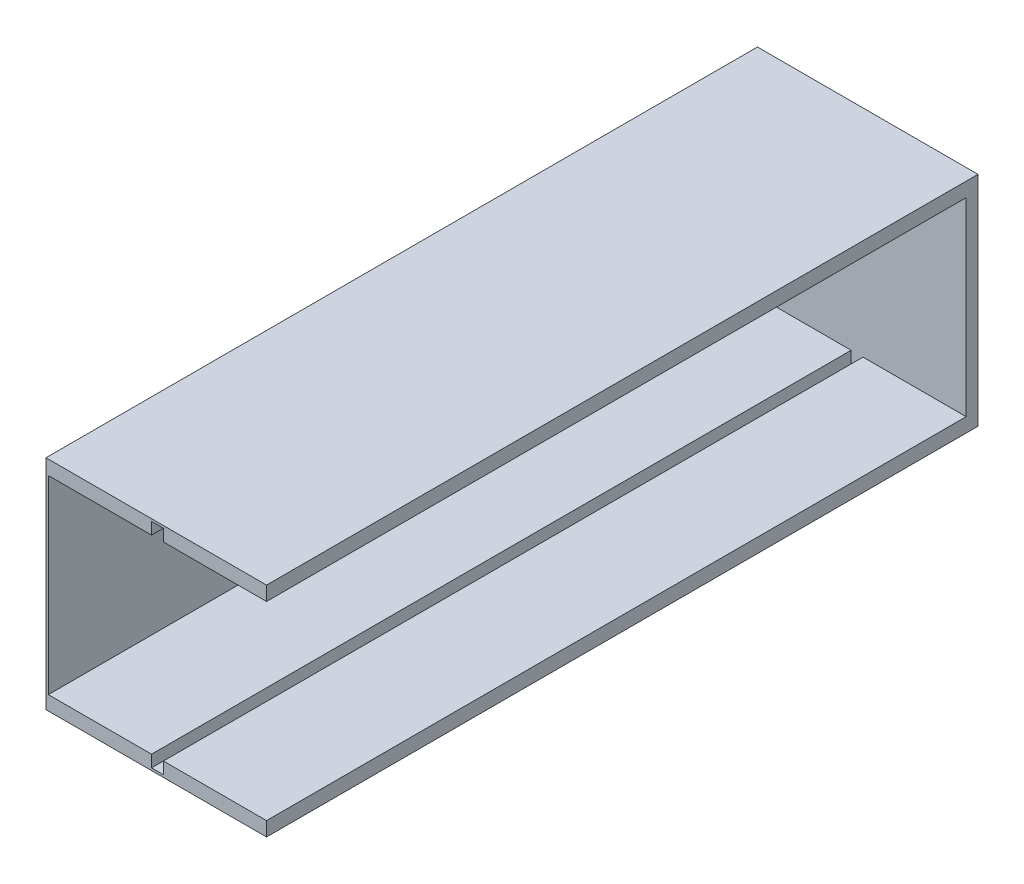
ISO-10303-21;
HEADER;
FILE_DESCRIPTION(('STEP AP214'),'2;1');
FILE_NAME('part.step','',(''),(''),'','','');
FILE_SCHEMA(('AUTOMOTIVE_DESIGN { 1 0 10303 214 1 1 1 1 }'));
ENDSEC;
DATA;
#1=APPLICATION_CONTEXT('core data for automotive mechanical design processes');
#2=APPLICATION_PROTOCOL_DEFINITION('international standard','automotive_design',2000,#1);
#3=PRODUCT_CONTEXT('',#1,'mechanical');
#4=PRODUCT('Part','Part','',(#3));
#5=PRODUCT_RELATED_PRODUCT_CATEGORY('part','',(#4));
#6=PRODUCT_DEFINITION_FORMATION('','',#4);
#7=PRODUCT_DEFINITION_CONTEXT('part definition',#1,'design');
#8=PRODUCT_DEFINITION('design','',#6,#7);
#9=PRODUCT_DEFINITION_SHAPE('','',#8);
#10=(LENGTH_UNIT() NAMED_UNIT(*) SI_UNIT(.MILLI.,.METRE.));
#11=(NAMED_UNIT(*) PLANE_ANGLE_UNIT() SI_UNIT($,.RADIAN.));
#12=(NAMED_UNIT(*) SI_UNIT($,.STERADIAN.) SOLID_ANGLE_UNIT());
#13=UNCERTAINTY_MEASURE_WITH_UNIT(LENGTH_MEASURE(1.E-05),#10,'distance_accuracy_value','');
#14=(GEOMETRIC_REPRESENTATION_CONTEXT(3) GLOBAL_UNCERTAINTY_ASSIGNED_CONTEXT((#13)) GLOBAL_UNIT_ASSIGNED_CONTEXT((#10,
#11,#12)) REPRESENTATION_CONTEXT('',''));
#15=CARTESIAN_POINT('',(0.,0.,0.));
#16=DIRECTION('',(0.,0.,1.));
#17=DIRECTION('',(1.,0.,0.));
#18=AXIS2_PLACEMENT_3D('',#15,#16,#17);
#19=CARTESIAN_POINT('',(0.,0.,25.));
#20=DIRECTION('',(0.,0.,1.));
#21=DIRECTION('',(1.,0.,0.));
#22=AXIS2_PLACEMENT_3D('',#19,#20,#21);
#23=PLANE('',#22);
#24=DIRECTION('',(0.,1.,0.));
#25=VECTOR('',#24,1.);
#26=CARTESIAN_POINT('',(242.5,0.,25.));
#27=LINE('',#26,#25);
#28=CARTESIAN_POINT('',(242.5,-455.,24.9999999999999));
#29=VERTEX_POINT('',#28);
#30=CARTESIAN_POINT('',(242.5,-430.,24.9999999999999));
#31=VERTEX_POINT('',#30);
#32=EDGE_CURVE('E43',#29,#31,#27,.T.);
#33=ORIENTED_EDGE('',*,*,#32,.T.);
#34=DIRECTION('',(1.,0.,0.));
#35=VECTOR('',#34,1.);
#36=CARTESIAN_POINT('',(0.,-430.,25.));
#37=LINE('',#36,#35);
#38=CARTESIAN_POINT('',(460.,-430.,24.9999999999999));
#39=VERTEX_POINT('',#38);
#40=EDGE_CURVE('E11',#31,#39,#37,.T.);
#41=ORIENTED_EDGE('',*,*,#40,.T.);
#42=DIRECTION('',(0.,-1.,0.));
#43=VECTOR('',#42,1.);
#44=CARTESIAN_POINT('',(460.,0.,25.));
#45=LINE('',#44,#43);
#46=CARTESIAN_POINT('',(460.,-30.,24.9999999999999));
#47=VERTEX_POINT('',#46);
#48=EDGE_CURVE('E215',#47,#39,#45,.T.);
#49=ORIENTED_EDGE('',*,*,#48,.F.);
#50=DIRECTION('',(1.,0.,0.));
#51=VECTOR('',#50,1.);
#52=CARTESIAN_POINT('',(242.5,-30.,24.9999999999999));
#53=LINE('',#52,#51);
#54=CARTESIAN_POINT('',(242.5,-30.,24.9999999999999));
#55=VERTEX_POINT('',#54);
#56=EDGE_CURVE('E222',#55,#47,#53,.T.);
#57=ORIENTED_EDGE('',*,*,#56,.F.);
#58=DIRECTION('',(0.,-1.,0.));
#59=VECTOR('',#58,1.);
#60=CARTESIAN_POINT('',(242.5,-5.00000000000004,24.9999999999999));
#61=LINE('',#60,#59);
#62=CARTESIAN_POINT('',(242.5,-5.00000000000004,24.9999999999999));
#63=VERTEX_POINT('',#62);
#64=EDGE_CURVE('E224',#63,#55,#61,.T.);
#65=ORIENTED_EDGE('',*,*,#64,.F.);
#66=DIRECTION('',(1.,0.,0.));
#67=VECTOR('',#66,1.);
#68=CARTESIAN_POINT('',(217.5,-5.00000000000004,24.9999999999999));
#69=LINE('',#68,#67);
#70=CARTESIAN_POINT('',(217.5,-5.00000000000004,24.9999999999999));
#71=VERTEX_POINT('',#70);
#72=EDGE_CURVE('E226',#71,#63,#69,.T.);
#73=ORIENTED_EDGE('',*,*,#72,.F.);
#74=DIRECTION('',(0.,1.,0.));
#75=VECTOR('',#74,1.);
#76=CARTESIAN_POINT('',(217.5,-30.,24.9999999999999));
#77=LINE('',#76,#75);
#78=CARTESIAN_POINT('',(217.5,-30.,24.9999999999999));
#79=VERTEX_POINT('',#78);
#80=EDGE_CURVE('E228',#79,#71,#77,.T.);
#81=ORIENTED_EDGE('',*,*,#80,.F.);
#82=DIRECTION('',(1.,0.,0.));
#83=VECTOR('',#82,1.);
#84=CARTESIAN_POINT('',(0.,-30.,24.9999999999999));
#85=LINE('',#84,#83);
#86=CARTESIAN_POINT('',(0.,-30.,24.9999999999999));
#87=VERTEX_POINT('',#86);
#88=EDGE_CURVE('E230',#87,#79,#85,.T.);
#89=ORIENTED_EDGE('',*,*,#88,.F.);
#90=DIRECTION('',(0.,1.,0.));
#91=VECTOR('',#90,1.);
#92=CARTESIAN_POINT('',(0.,0.,25.));
#93=LINE('',#92,#91);
#94=CARTESIAN_POINT('',(0.,-430.,24.9999999999999));
#95=VERTEX_POINT('',#94);
#96=EDGE_CURVE('E58',#95,#87,#93,.T.);
#97=ORIENTED_EDGE('',*,*,#96,.F.);
#98=DIRECTION('',(1.,0.,0.));
#99=VECTOR('',#98,1.);
#100=CARTESIAN_POINT('',(2.19492368086813E-13,-430.,25.));
#101=LINE('',#100,#99);
#102=CARTESIAN_POINT('',(217.5,-430.,25.));
#103=VERTEX_POINT('',#102);
#104=EDGE_CURVE('E264',#95,#103,#101,.T.);
#105=ORIENTED_EDGE('',*,*,#104,.T.);
#106=DIRECTION('',(0.,-1.,0.));
#107=VECTOR('',#106,1.);
#108=CARTESIAN_POINT('',(217.5,0.,25.));
#109=LINE('',#108,#107);
#110=CARTESIAN_POINT('',(217.5,-455.,24.9999999999999));
#111=VERTEX_POINT('',#110);
#112=EDGE_CURVE('E267',#103,#111,#109,.T.);
#113=ORIENTED_EDGE('',*,*,#112,.T.);
#114=DIRECTION('',(1.,0.,0.));
#115=VECTOR('',#114,1.);
#116=CARTESIAN_POINT('',(0.,-455.,25.));
#117=LINE('',#116,#115);
#118=EDGE_CURVE('E270',#111,#29,#117,.T.);
#119=ORIENTED_EDGE('',*,*,#118,.T.);
#120=EDGE_LOOP('',(#33,#41,#49,#57,#65,#73,#81,#89,#97,#105,#113,#119));
#121=FACE_BOUND('',#120,.T.);
#122=ADVANCED_FACE('F35',(#121),#23,.T.);
#123=CARTESIAN_POINT('',(0.,-30.,1500.));
#124=DIRECTION('',(0.,1.,0.));
#125=DIRECTION('',(-1.,0.,0.));
#126=AXIS2_PLACEMENT_3D('',#123,#124,#125);
#127=PLANE('',#126);
#128=DIRECTION('',(0.,0.,-1.));
#129=VECTOR('',#128,1.);
#130=CARTESIAN_POINT('',(0.,-30.,1500.));
#131=LINE('',#130,#129);
#132=CARTESIAN_POINT('',(0.,-30.,1500.));
#133=VERTEX_POINT('',#132);
#134=EDGE_CURVE('E262',#133,#87,#131,.T.);
#135=ORIENTED_EDGE('',*,*,#134,.T.);
#136=ORIENTED_EDGE('',*,*,#88,.T.);
#137=DIRECTION('',(0.,0.,-1.));
#138=VECTOR('',#137,1.);
#139=CARTESIAN_POINT('',(217.5,-30.,1500.));
#140=LINE('',#139,#138);
#141=CARTESIAN_POINT('',(217.5,-30.,1500.));
#142=VERTEX_POINT('',#141);
#143=EDGE_CURVE('E259',#142,#79,#140,.T.);
#144=ORIENTED_EDGE('',*,*,#143,.F.);
#145=DIRECTION('',(1.,0.,0.));
#146=VECTOR('',#145,1.);
#147=CARTESIAN_POINT('',(0.,-30.,1500.));
#148=LINE('',#147,#146);
#149=EDGE_CURVE('E233',#133,#142,#148,.T.);
#150=ORIENTED_EDGE('',*,*,#149,.F.);
#151=EDGE_LOOP('',(#135,#136,#144,#150));
#152=FACE_BOUND('',#151,.T.);
#153=ADVANCED_FACE('F37',(#152),#127,.F.);
#154=CARTESIAN_POINT('',(217.5,-30.,1500.));
#155=DIRECTION('',(-1.,0.,0.));
#156=DIRECTION('',(0.,0.,1.));
#157=AXIS2_PLACEMENT_3D('',#154,#155,#156);
#158=PLANE('',#157);
#159=ORIENTED_EDGE('',*,*,#143,.T.);
#160=ORIENTED_EDGE('',*,*,#80,.T.);
#161=DIRECTION('',(0.,0.,-1.));
#162=VECTOR('',#161,1.);
#163=CARTESIAN_POINT('',(217.5,-5.00000000000004,1500.));
#164=LINE('',#163,#162);
#165=CARTESIAN_POINT('',(217.5,-5.00000000000004,1500.));
#166=VERTEX_POINT('',#165);
#167=EDGE_CURVE('E256',#166,#71,#164,.T.);
#168=ORIENTED_EDGE('',*,*,#167,.F.);
#169=DIRECTION('',(0.,1.,0.));
#170=VECTOR('',#169,1.);
#171=CARTESIAN_POINT('',(217.5,-30.,1500.));
#172=LINE('',#171,#170);
#173=EDGE_CURVE('E235',#142,#166,#172,.T.);
#174=ORIENTED_EDGE('',*,*,#173,.F.);
#175=EDGE_LOOP('',(#159,#160,#168,#174));
#176=FACE_BOUND('',#175,.T.);
#177=ADVANCED_FACE('F311',(#176),#158,.F.);
#178=CARTESIAN_POINT('',(217.5,-5.00000000000004,1500.));
#179=DIRECTION('',(0.,1.,0.));
#180=DIRECTION('',(-1.,0.,0.));
#181=AXIS2_PLACEMENT_3D('',#178,#179,#180);
#182=PLANE('',#181);
#183=ORIENTED_EDGE('',*,*,#167,.T.);
#184=ORIENTED_EDGE('',*,*,#72,.T.);
#185=DIRECTION('',(0.,0.,-1.));
#186=VECTOR('',#185,1.);
#187=CARTESIAN_POINT('',(242.5,-5.00000000000004,1500.));
#188=LINE('',#187,#186);
#189=CARTESIAN_POINT('',(242.5,-5.00000000000004,1500.));
#190=VERTEX_POINT('',#189);
#191=EDGE_CURVE('E253',#190,#63,#188,.T.);
#192=ORIENTED_EDGE('',*,*,#191,.F.);
#193=DIRECTION('',(1.,0.,0.));
#194=VECTOR('',#193,1.);
#195=CARTESIAN_POINT('',(217.5,-5.00000000000004,1500.));
#196=LINE('',#195,#194);
#197=EDGE_CURVE('E237',#166,#190,#196,.T.);
#198=ORIENTED_EDGE('',*,*,#197,.F.);
#199=EDGE_LOOP('',(#183,#184,#192,#198));
#200=FACE_BOUND('',#199,.T.);
#201=ADVANCED_FACE('F306',(#200),#182,.F.);
#202=CARTESIAN_POINT('',(242.5,-5.00000000000004,1500.));
#203=DIRECTION('',(1.,0.,0.));
#204=DIRECTION('',(0.,0.,-1.));
#205=AXIS2_PLACEMENT_3D('',#202,#203,#204);
#206=PLANE('',#205);
#207=ORIENTED_EDGE('',*,*,#191,.T.);
#208=ORIENTED_EDGE('',*,*,#64,.T.);
#209=DIRECTION('',(0.,0.,-1.));
#210=VECTOR('',#209,1.);
#211=CARTESIAN_POINT('',(242.5,-30.,1500.));
#212=LINE('',#211,#210);
#213=CARTESIAN_POINT('',(242.5,-30.,1500.));
#214=VERTEX_POINT('',#213);
#215=EDGE_CURVE('E250',#214,#55,#212,.T.);
#216=ORIENTED_EDGE('',*,*,#215,.F.);
#217=DIRECTION('',(0.,-1.,0.));
#218=VECTOR('',#217,1.);
#219=CARTESIAN_POINT('',(242.5,-5.00000000000004,1500.));
#220=LINE('',#219,#218);
#221=EDGE_CURVE('E239',#190,#214,#220,.T.);
#222=ORIENTED_EDGE('',*,*,#221,.F.);
#223=EDGE_LOOP('',(#207,#208,#216,#222));
#224=FACE_BOUND('',#223,.T.);
#225=ADVANCED_FACE('F302',(#224),#206,.F.);
#226=CARTESIAN_POINT('',(242.5,-30.,1500.));
#227=DIRECTION('',(0.,1.,0.));
#228=DIRECTION('',(0.,0.,1.));
#229=AXIS2_PLACEMENT_3D('',#226,#227,#228);
#230=PLANE('',#229);
#231=ORIENTED_EDGE('',*,*,#215,.T.);
#232=ORIENTED_EDGE('',*,*,#56,.T.);
#233=DIRECTION('',(0.,0.,-1.));
#234=VECTOR('',#233,1.);
#235=CARTESIAN_POINT('',(460.,-30.,1500.));
#236=LINE('',#235,#234);
#237=CARTESIAN_POINT('',(460.,-30.,1500.));
#238=VERTEX_POINT('',#237);
#239=EDGE_CURVE('E247',#238,#47,#236,.T.);
#240=ORIENTED_EDGE('',*,*,#239,.F.);
#241=DIRECTION('',(1.,0.,0.));
#242=VECTOR('',#241,1.);
#243=CARTESIAN_POINT('',(242.5,-30.,1500.));
#244=LINE('',#243,#242);
#245=EDGE_CURVE('E241',#214,#238,#244,.T.);
#246=ORIENTED_EDGE('',*,*,#245,.F.);
#247=EDGE_LOOP('',(#231,#232,#240,#246));
#248=FACE_BOUND('',#247,.T.);
#249=ADVANCED_FACE('F297',(#248),#230,.F.);
#250=CARTESIAN_POINT('',(460.,0.,1500.));
#251=DIRECTION('',(-1.,0.,0.));
#252=DIRECTION('',(0.,0.,1.));
#253=AXIS2_PLACEMENT_3D('',#250,#251,#252);
#254=PLANE('',#253);
#255=DIRECTION('',(0.,1.,0.));
#256=VECTOR('',#255,1.);
#257=CARTESIAN_POINT('',(460.,0.,0.));
#258=LINE('',#257,#256);
#259=CARTESIAN_POINT('',(460.,-460.,0.));
#260=VERTEX_POINT('',#259);
#261=CARTESIAN_POINT('',(460.,0.,0.));
#262=VERTEX_POINT('',#261);
#263=EDGE_CURVE('E232',#260,#262,#258,.T.);
#264=ORIENTED_EDGE('',*,*,#263,.T.);
#265=DIRECTION('',(0.,0.,-1.));
#266=VECTOR('',#265,1.);
#267=CARTESIAN_POINT('',(460.,0.,1500.));
#268=LINE('',#267,#266);
#269=CARTESIAN_POINT('',(460.,0.,1500.));
#270=VERTEX_POINT('',#269);
#271=EDGE_CURVE('E161',#270,#262,#268,.T.);
#272=ORIENTED_EDGE('',*,*,#271,.F.);
#273=DIRECTION('',(0.,1.,0.));
#274=VECTOR('',#273,1.);
#275=CARTESIAN_POINT('',(460.,0.,1500.));
#276=LINE('',#275,#274);
#277=EDGE_CURVE('E157',#238,#270,#276,.T.);
#278=ORIENTED_EDGE('',*,*,#277,.F.);
#279=ORIENTED_EDGE('',*,*,#239,.T.);
#280=ORIENTED_EDGE('',*,*,#48,.T.);
#281=DIRECTION('',(0.,0.,-1.));
#282=VECTOR('',#281,1.);
#283=CARTESIAN_POINT('',(460.,-430.,1500.));
#284=LINE('',#283,#282);
#285=CARTESIAN_POINT('',(460.,-430.,1500.));
#286=VERTEX_POINT('',#285);
#287=EDGE_CURVE('E211',#286,#39,#284,.T.);
#288=ORIENTED_EDGE('',*,*,#287,.F.);
#289=DIRECTION('',(0.,1.,0.));
#290=VECTOR('',#289,1.);
#291=CARTESIAN_POINT('',(460.,-460.,1500.));
#292=LINE('',#291,#290);
#293=CARTESIAN_POINT('',(460.,-460.,1500.));
#294=VERTEX_POINT('',#293);
#295=EDGE_CURVE('E186',#294,#286,#292,.T.);
#296=ORIENTED_EDGE('',*,*,#295,.F.);
#297=DIRECTION('',(0.,0.,-1.));
#298=VECTOR('',#297,1.);
#299=CARTESIAN_POINT('',(460.,-460.,25.));
#300=LINE('',#299,#298);
#301=EDGE_CURVE('E218',#294,#260,#300,.T.);
#302=ORIENTED_EDGE('',*,*,#301,.T.);
#303=EDGE_LOOP('',(#264,#272,#278,#279,#280,#288,#296,#302));
#304=FACE_BOUND('',#303,.T.);
#305=ADVANCED_FACE('F291',(#304),#254,.F.);
#306=CARTESIAN_POINT('',(0.,0.,1500.));
#307=DIRECTION('',(0.,-1.,0.));
#308=DIRECTION('',(0.,0.,-1.));
#309=AXIS2_PLACEMENT_3D('',#306,#307,#308);
#310=PLANE('',#309);
#311=ORIENTED_EDGE('',*,*,#271,.T.);
#312=DIRECTION('',(-1.,0.,0.));
#313=VECTOR('',#312,1.);
#314=CARTESIAN_POINT('',(0.,0.,0.));
#315=LINE('',#314,#313);
#316=CARTESIAN_POINT('',(-5.,0.,0.));
#317=VERTEX_POINT('',#316);
#318=EDGE_CURVE('E167',#262,#317,#315,.T.);
#319=ORIENTED_EDGE('',*,*,#318,.T.);
#320=DIRECTION('',(0.,0.,-1.));
#321=VECTOR('',#320,1.);
#322=CARTESIAN_POINT('',(-5.,0.,1500.));
#323=LINE('',#322,#321);
#324=CARTESIAN_POINT('',(-5.,0.,1500.));
#325=VERTEX_POINT('',#324);
#326=EDGE_CURVE('E164',#325,#317,#323,.T.);
#327=ORIENTED_EDGE('',*,*,#326,.F.);
#328=DIRECTION('',(-1.,0.,0.));
#329=VECTOR('',#328,1.);
#330=CARTESIAN_POINT('',(0.,0.,1500.));
#331=LINE('',#330,#329);
#332=EDGE_CURVE('E150',#270,#325,#331,.T.);
#333=ORIENTED_EDGE('',*,*,#332,.F.);
#334=EDGE_LOOP('',(#311,#319,#327,#333));
#335=FACE_BOUND('',#334,.T.);
#336=ADVANCED_FACE('F165',(#335),#310,.F.);
#337=CARTESIAN_POINT('',(0.,0.,1500.));
#338=DIRECTION('',(0.,0.,-1.));
#339=DIRECTION('',(-1.,0.,0.));
#340=AXIS2_PLACEMENT_3D('',#337,#338,#339);
#341=PLANE('',#340);
#342=ORIENTED_EDGE('',*,*,#332,.T.);
#343=DIRECTION('',(0.,1.,0.));
#344=VECTOR('',#343,1.);
#345=CARTESIAN_POINT('',(-5.,0.,1500.));
#346=LINE('',#345,#344);
#347=CARTESIAN_POINT('',(-4.99999999999995,-460.,1500.));
#348=VERTEX_POINT('',#347);
#349=EDGE_CURVE('E155',#348,#325,#346,.T.);
#350=ORIENTED_EDGE('',*,*,#349,.F.);
#351=DIRECTION('',(1.,0.,0.));
#352=VECTOR('',#351,1.);
#353=CARTESIAN_POINT('',(0.,-460.,1500.));
#354=LINE('',#353,#352);
#355=EDGE_CURVE('E183',#348,#294,#354,.T.);
#356=ORIENTED_EDGE('',*,*,#355,.T.);
#357=ORIENTED_EDGE('',*,*,#295,.T.);
#358=DIRECTION('',(-1.,0.,0.));
#359=VECTOR('',#358,1.);
#360=CARTESIAN_POINT('',(242.5,-430.,1500.));
#361=LINE('',#360,#359);
#362=CARTESIAN_POINT('',(242.5,-430.,1500.));
#363=VERTEX_POINT('',#362);
#364=EDGE_CURVE('E188',#286,#363,#361,.T.);
#365=ORIENTED_EDGE('',*,*,#364,.T.);
#366=DIRECTION('',(0.,-1.,0.));
#367=VECTOR('',#366,1.);
#368=CARTESIAN_POINT('',(242.5,-455.,1500.));
#369=LINE('',#368,#367);
#370=CARTESIAN_POINT('',(242.5,-455.,1500.));
#371=VERTEX_POINT('',#370);
#372=EDGE_CURVE('E190',#363,#371,#369,.T.);
#373=ORIENTED_EDGE('',*,*,#372,.T.);
#374=DIRECTION('',(-1.,0.,0.));
#375=VECTOR('',#374,1.);
#376=CARTESIAN_POINT('',(217.5,-455.,1500.));
#377=LINE('',#376,#375);
#378=CARTESIAN_POINT('',(217.5,-455.,1500.));
#379=VERTEX_POINT('',#378);
#380=EDGE_CURVE('E192',#371,#379,#377,.T.);
#381=ORIENTED_EDGE('',*,*,#380,.T.);
#382=DIRECTION('',(0.,1.,0.));
#383=VECTOR('',#382,1.);
#384=CARTESIAN_POINT('',(217.5,-430.,1500.));
#385=LINE('',#384,#383);
#386=CARTESIAN_POINT('',(217.5,-430.,1500.));
#387=VERTEX_POINT('',#386);
#388=EDGE_CURVE('E194',#379,#387,#385,.T.);
#389=ORIENTED_EDGE('',*,*,#388,.T.);
#390=DIRECTION('',(-1.,0.,0.));
#391=VECTOR('',#390,1.);
#392=CARTESIAN_POINT('',(0.,-430.,1500.));
#393=LINE('',#392,#391);
#394=CARTESIAN_POINT('',(0.,-430.,1500.));
#395=VERTEX_POINT('',#394);
#396=EDGE_CURVE('E196',#387,#395,#393,.T.);
#397=ORIENTED_EDGE('',*,*,#396,.T.);
#398=DIRECTION('',(0.,1.,0.));
#399=VECTOR('',#398,1.);
#400=CARTESIAN_POINT('',(0.,0.,1500.));
#401=LINE('',#400,#399);
#402=EDGE_CURVE('E177',#395,#133,#401,.T.);
#403=ORIENTED_EDGE('',*,*,#402,.T.);
#404=ORIENTED_EDGE('',*,*,#149,.T.);
#405=ORIENTED_EDGE('',*,*,#173,.T.);
#406=ORIENTED_EDGE('',*,*,#197,.T.);
#407=ORIENTED_EDGE('',*,*,#221,.T.);
#408=ORIENTED_EDGE('',*,*,#245,.T.);
#409=ORIENTED_EDGE('',*,*,#277,.T.);
#410=EDGE_LOOP('',(#342,#350,#356,#357,#365,#373,#381,#389,#397,#403,#404,#405,#406,#407,#408,#409));
#411=FACE_BOUND('',#410,.T.);
#412=ADVANCED_FACE('F152',(#411),#341,.F.);
#413=CARTESIAN_POINT('',(0.,0.,0.));
#414=DIRECTION('',(0.,0.,-1.));
#415=DIRECTION('',(-1.,0.,0.));
#416=AXIS2_PLACEMENT_3D('',#413,#414,#415);
#417=PLANE('',#416);
#418=ORIENTED_EDGE('',*,*,#318,.F.);
#419=ORIENTED_EDGE('',*,*,#263,.F.);
#420=DIRECTION('',(-1.,0.,0.));
#421=VECTOR('',#420,1.);
#422=CARTESIAN_POINT('',(0.,-460.,0.));
#423=LINE('',#422,#421);
#424=CARTESIAN_POINT('',(-4.99999999999995,-460.,0.));
#425=VERTEX_POINT('',#424);
#426=EDGE_CURVE('E213',#260,#425,#423,.T.);
#427=ORIENTED_EDGE('',*,*,#426,.T.);
#428=DIRECTION('',(0.,-1.,0.));
#429=VECTOR('',#428,1.);
#430=CARTESIAN_POINT('',(-5.,0.,0.));
#431=LINE('',#430,#429);
#432=EDGE_CURVE('E171',#317,#425,#431,.T.);
#433=ORIENTED_EDGE('',*,*,#432,.F.);
#434=EDGE_LOOP('',(#418,#419,#427,#433));
#435=FACE_BOUND('',#434,.T.);
#436=ADVANCED_FACE('F341',(#435),#417,.T.);
#437=CARTESIAN_POINT('',(0.,-460.,25.));
#438=DIRECTION('',(0.,-1.,0.));
#439=DIRECTION('',(0.,0.,-1.));
#440=AXIS2_PLACEMENT_3D('',#437,#438,#439);
#441=PLANE('',#440);
#442=ORIENTED_EDGE('',*,*,#426,.F.);
#443=ORIENTED_EDGE('',*,*,#301,.F.);
#444=ORIENTED_EDGE('',*,*,#355,.F.);
#445=DIRECTION('',(0.,0.,1.));
#446=VECTOR('',#445,1.);
#447=CARTESIAN_POINT('',(-4.99999999999995,-460.,1500.));
#448=LINE('',#447,#446);
#449=EDGE_CURVE('E176',#425,#348,#448,.T.);
#450=ORIENTED_EDGE('',*,*,#449,.F.);
#451=EDGE_LOOP('',(#442,#443,#444,#450));
#452=FACE_BOUND('',#451,.T.);
#453=ADVANCED_FACE('F338',(#452),#441,.T.);
#454=CARTESIAN_POINT('',(242.5,-430.,1500.));
#455=DIRECTION('',(0.,-1.,0.));
#456=DIRECTION('',(0.,0.,-1.));
#457=AXIS2_PLACEMENT_3D('',#454,#455,#456);
#458=PLANE('',#457);
#459=ORIENTED_EDGE('',*,*,#40,.F.);
#460=DIRECTION('',(0.,0.,-1.));
#461=VECTOR('',#460,1.);
#462=CARTESIAN_POINT('',(242.5,-430.,1500.));
#463=LINE('',#462,#461);
#464=EDGE_CURVE('E208',#363,#31,#463,.T.);
#465=ORIENTED_EDGE('',*,*,#464,.F.);
#466=ORIENTED_EDGE('',*,*,#364,.F.);
#467=ORIENTED_EDGE('',*,*,#287,.T.);
#468=EDGE_LOOP('',(#459,#465,#466,#467));
#469=FACE_BOUND('',#468,.T.);
#470=ADVANCED_FACE('F289',(#469),#458,.F.);
#471=CARTESIAN_POINT('',(242.5,-455.,1500.));
#472=DIRECTION('',(1.,0.,0.));
#473=DIRECTION('',(0.,0.,-1.));
#474=AXIS2_PLACEMENT_3D('',#471,#472,#473);
#475=PLANE('',#474);
#476=ORIENTED_EDGE('',*,*,#32,.F.);
#477=DIRECTION('',(0.,0.,-1.));
#478=VECTOR('',#477,1.);
#479=CARTESIAN_POINT('',(242.5,-455.,1500.));
#480=LINE('',#479,#478);
#481=EDGE_CURVE('E205',#371,#29,#480,.T.);
#482=ORIENTED_EDGE('',*,*,#481,.F.);
#483=ORIENTED_EDGE('',*,*,#372,.F.);
#484=ORIENTED_EDGE('',*,*,#464,.T.);
#485=EDGE_LOOP('',(#476,#482,#483,#484));
#486=FACE_BOUND('',#485,.T.);
#487=ADVANCED_FACE('F277',(#486),#475,.F.);
#488=CARTESIAN_POINT('',(217.5,-455.,1500.));
#489=DIRECTION('',(0.,-1.,0.));
#490=DIRECTION('',(0.,0.,-1.));
#491=AXIS2_PLACEMENT_3D('',#488,#489,#490);
#492=PLANE('',#491);
#493=ORIENTED_EDGE('',*,*,#118,.F.);
#494=DIRECTION('',(0.,0.,-1.));
#495=VECTOR('',#494,1.);
#496=CARTESIAN_POINT('',(217.5,-455.,1500.));
#497=LINE('',#496,#495);
#498=EDGE_CURVE('E202',#379,#111,#497,.T.);
#499=ORIENTED_EDGE('',*,*,#498,.F.);
#500=ORIENTED_EDGE('',*,*,#380,.F.);
#501=ORIENTED_EDGE('',*,*,#481,.T.);
#502=EDGE_LOOP('',(#493,#499,#500,#501));
#503=FACE_BOUND('',#502,.T.);
#504=ADVANCED_FACE('F282',(#503),#492,.F.);
#505=CARTESIAN_POINT('',(217.5,-430.,1500.));
#506=DIRECTION('',(-1.,0.,0.));
#507=DIRECTION('',(0.,0.,1.));
#508=AXIS2_PLACEMENT_3D('',#505,#506,#507);
#509=PLANE('',#508);
#510=ORIENTED_EDGE('',*,*,#112,.F.);
#511=DIRECTION('',(0.,0.,-1.));
#512=VECTOR('',#511,1.);
#513=CARTESIAN_POINT('',(217.5,-430.,1500.));
#514=LINE('',#513,#512);
#515=EDGE_CURVE('E50',#387,#103,#514,.T.);
#516=ORIENTED_EDGE('',*,*,#515,.F.);
#517=ORIENTED_EDGE('',*,*,#388,.F.);
#518=ORIENTED_EDGE('',*,*,#498,.T.);
#519=EDGE_LOOP('',(#510,#516,#517,#518));
#520=FACE_BOUND('',#519,.T.);
#521=ADVANCED_FACE('F320',(#520),#509,.F.);
#522=CARTESIAN_POINT('',(0.,-430.,1500.));
#523=DIRECTION('',(0.,-1.,0.));
#524=DIRECTION('',(1.,0.,0.));
#525=AXIS2_PLACEMENT_3D('',#522,#523,#524);
#526=PLANE('',#525);
#527=ORIENTED_EDGE('',*,*,#104,.F.);
#528=DIRECTION('',(0.,0.,-1.));
#529=VECTOR('',#528,1.);
#530=CARTESIAN_POINT('',(0.,-430.,1500.));
#531=LINE('',#530,#529);
#532=EDGE_CURVE('E199',#395,#95,#531,.T.);
#533=ORIENTED_EDGE('',*,*,#532,.F.);
#534=ORIENTED_EDGE('',*,*,#396,.F.);
#535=ORIENTED_EDGE('',*,*,#515,.T.);
#536=EDGE_LOOP('',(#527,#533,#534,#535));
#537=FACE_BOUND('',#536,.T.);
#538=ADVANCED_FACE('F318',(#537),#526,.F.);
#539=CARTESIAN_POINT('',(-5.,0.,0.));
#540=DIRECTION('',(1.,0.,0.));
#541=DIRECTION('',(0.,1.,0.));
#542=AXIS2_PLACEMENT_3D('',#539,#540,#541);
#543=PLANE('',#542);
#544=ORIENTED_EDGE('',*,*,#349,.T.);
#545=ORIENTED_EDGE('',*,*,#326,.T.);
#546=ORIENTED_EDGE('',*,*,#432,.T.);
#547=ORIENTED_EDGE('',*,*,#449,.T.);
#548=EDGE_LOOP('',(#544,#545,#546,#547));
#549=FACE_BOUND('',#548,.T.);
#550=ADVANCED_FACE('F174',(#549),#543,.F.);
#551=CARTESIAN_POINT('',(0.,0.,0.));
#552=DIRECTION('',(1.,0.,0.));
#553=DIRECTION('',(0.,1.,0.));
#554=AXIS2_PLACEMENT_3D('',#551,#552,#553);
#555=PLANE('',#554);
#556=ORIENTED_EDGE('',*,*,#402,.F.);
#557=ORIENTED_EDGE('',*,*,#532,.T.);
#558=ORIENTED_EDGE('',*,*,#96,.T.);
#559=ORIENTED_EDGE('',*,*,#134,.F.);
#560=EDGE_LOOP('',(#556,#557,#558,#559));
#561=FACE_BOUND('',#560,.T.);
#562=ADVANCED_FACE('F316',(#561),#555,.T.);
#563=CLOSED_SHELL('',(#122,#153,#177,#201,#225,#249,#305,#336,#412,#436,#453,#470,#487,#504,
#521,#538,#550,#562));
#564=MANIFOLD_SOLID_BREP('B2',#563);
#565=ADVANCED_BREP_SHAPE_REPRESENTATION('',(#18,#564),#14);
#566=SHAPE_DEFINITION_REPRESENTATION(#9,#565);
ENDSEC;
END-ISO-10303-21;
